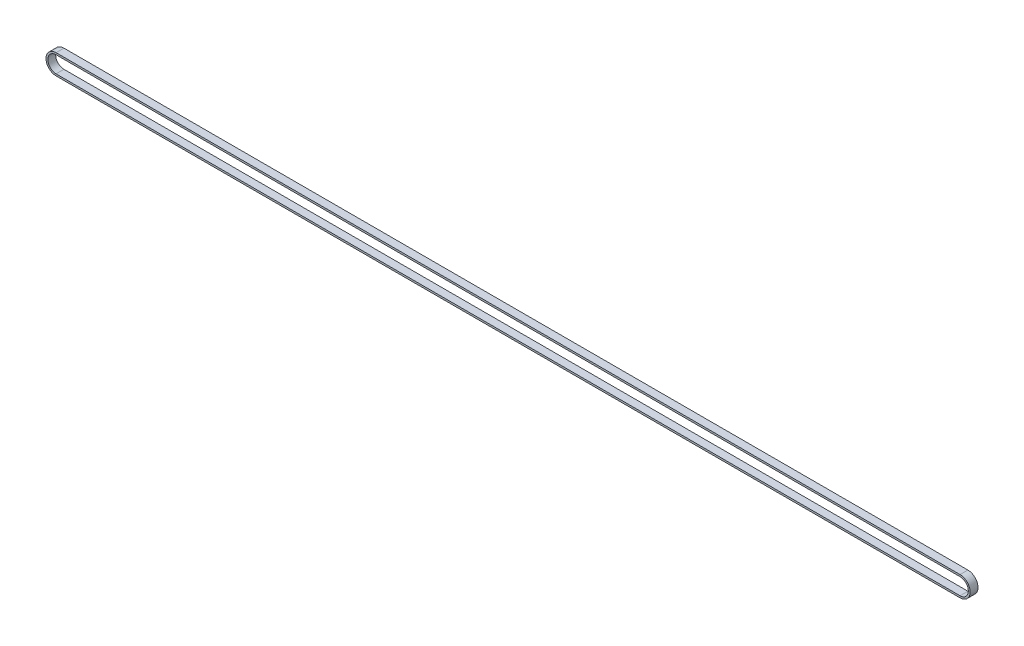
ISO-10303-21;
HEADER;
FILE_DESCRIPTION(('STEP AP214'),'2;1');
FILE_NAME('part.step','',(''),(''),'','','');
FILE_SCHEMA(('AUTOMOTIVE_DESIGN { 1 0 10303 214 1 1 1 1 }'));
ENDSEC;
DATA;
#1=APPLICATION_CONTEXT('core data for automotive mechanical design processes');
#2=APPLICATION_PROTOCOL_DEFINITION('international standard','automotive_design',2000,#1);
#3=PRODUCT_CONTEXT('',#1,'mechanical');
#4=PRODUCT('Part','Part','',(#3));
#5=PRODUCT_RELATED_PRODUCT_CATEGORY('part','',(#4));
#6=PRODUCT_DEFINITION_FORMATION('','',#4);
#7=PRODUCT_DEFINITION_CONTEXT('part definition',#1,'design');
#8=PRODUCT_DEFINITION('design','',#6,#7);
#9=PRODUCT_DEFINITION_SHAPE('','',#8);
#10=(LENGTH_UNIT() NAMED_UNIT(*) SI_UNIT(.MILLI.,.METRE.));
#11=(NAMED_UNIT(*) PLANE_ANGLE_UNIT() SI_UNIT($,.RADIAN.));
#12=(NAMED_UNIT(*) SI_UNIT($,.STERADIAN.) SOLID_ANGLE_UNIT());
#13=UNCERTAINTY_MEASURE_WITH_UNIT(LENGTH_MEASURE(1.E-05),#10,'distance_accuracy_value','');
#14=(GEOMETRIC_REPRESENTATION_CONTEXT(3) GLOBAL_UNCERTAINTY_ASSIGNED_CONTEXT((#13)) GLOBAL_UNIT_ASSIGNED_CONTEXT((#10,
#11,#12)) REPRESENTATION_CONTEXT('',''));
#15=CARTESIAN_POINT('',(0.,0.,0.));
#16=DIRECTION('',(0.,0.,1.));
#17=DIRECTION('',(1.,0.,0.));
#18=AXIS2_PLACEMENT_3D('',#15,#16,#17);
#19=CARTESIAN_POINT('',(0.,-6.3,1.5));
#20=DIRECTION('',(0.,-1.,0.));
#21=DIRECTION('',(0.,0.,-1.));
#22=AXIS2_PLACEMENT_3D('',#19,#20,#21);
#23=PLANE('',#22);
#24=DIRECTION('',(1.,0.,0.));
#25=VECTOR('',#24,1.);
#26=CARTESIAN_POINT('',(0.,-6.3,7.5));
#27=LINE('',#26,#25);
#28=CARTESIAN_POINT('',(0.,-6.3,7.5));
#29=VERTEX_POINT('',#28);
#30=CARTESIAN_POINT('',(690.,-6.3,7.5));
#31=VERTEX_POINT('',#30);
#32=EDGE_CURVE('E152',#29,#31,#27,.T.);
#33=ORIENTED_EDGE('',*,*,#32,.T.);
#34=DIRECTION('',(0.,0.,1.));
#35=VECTOR('',#34,1.);
#36=CARTESIAN_POINT('',(690.,-6.3,1.5));
#37=LINE('',#36,#35);
#38=CARTESIAN_POINT('',(690.,-6.3,1.5));
#39=VERTEX_POINT('',#38);
#40=EDGE_CURVE('E10',#39,#31,#37,.T.);
#41=ORIENTED_EDGE('',*,*,#40,.F.);
#42=DIRECTION('',(1.,0.,0.));
#43=VECTOR('',#42,1.);
#44=CARTESIAN_POINT('',(0.,-6.3,1.5));
#45=LINE('',#44,#43);
#46=CARTESIAN_POINT('',(0.,-6.3,1.5));
#47=VERTEX_POINT('',#46);
#48=EDGE_CURVE('E180',#47,#39,#45,.T.);
#49=ORIENTED_EDGE('',*,*,#48,.F.);
#50=DIRECTION('',(0.,0.,1.));
#51=VECTOR('',#50,1.);
#52=CARTESIAN_POINT('',(0.,-6.3,1.5));
#53=LINE('',#52,#51);
#54=EDGE_CURVE('E25',#47,#29,#53,.T.);
#55=ORIENTED_EDGE('',*,*,#54,.T.);
#56=EDGE_LOOP('',(#33,#41,#49,#55));
#57=FACE_BOUND('',#56,.T.);
#58=ADVANCED_FACE('F16',(#57),#23,.F.);
#59=CARTESIAN_POINT('',(690.,0.,1.));
#60=DIRECTION('',(0.,0.,1.));
#61=DIRECTION('',(0.,-1.,0.));
#62=AXIS2_PLACEMENT_3D('',#59,#60,#61);
#63=CYLINDRICAL_SURFACE('',#62,6.3);
#64=DIRECTION('',(0.,0.,1.));
#65=VECTOR('',#64,1.);
#66=CARTESIAN_POINT('',(690.,6.3,1.5));
#67=LINE('',#66,#65);
#68=CARTESIAN_POINT('',(690.,6.3,1.5));
#69=VERTEX_POINT('',#68);
#70=CARTESIAN_POINT('',(690.,6.3,7.5));
#71=VERTEX_POINT('',#70);
#72=EDGE_CURVE('E36',#69,#71,#67,.T.);
#73=ORIENTED_EDGE('',*,*,#72,.F.);
#74=CARTESIAN_POINT('',(690.,0.,1.5));
#75=DIRECTION('',(0.,0.,1.));
#76=DIRECTION('',(0.,-1.,0.));
#77=AXIS2_PLACEMENT_3D('',#74,#75,#76);
#78=CIRCLE('',#77,6.3);
#79=EDGE_CURVE('E170',#39,#69,#78,.T.);
#80=ORIENTED_EDGE('',*,*,#79,.F.);
#81=ORIENTED_EDGE('',*,*,#40,.T.);
#82=CARTESIAN_POINT('',(690.,0.,7.5));
#83=DIRECTION('',(0.,0.,1.));
#84=DIRECTION('',(0.,-1.,0.));
#85=AXIS2_PLACEMENT_3D('',#82,#83,#84);
#86=CIRCLE('',#85,6.3);
#87=EDGE_CURVE('E144',#31,#71,#86,.T.);
#88=ORIENTED_EDGE('',*,*,#87,.T.);
#89=EDGE_LOOP('',(#73,#80,#81,#88));
#90=FACE_BOUND('',#89,.T.);
#91=ADVANCED_FACE('F199',(#90),#63,.F.);
#92=CARTESIAN_POINT('',(0.,0.,1.));
#93=DIRECTION('',(0.,0.,1.));
#94=DIRECTION('',(0.,-1.,0.));
#95=AXIS2_PLACEMENT_3D('',#92,#93,#94);
#96=CYLINDRICAL_SURFACE('',#95,6.3);
#97=CARTESIAN_POINT('',(0.,0.,1.5));
#98=DIRECTION('',(0.,0.,1.));
#99=DIRECTION('',(0.,-1.,0.));
#100=AXIS2_PLACEMENT_3D('',#97,#98,#99);
#101=CIRCLE('',#100,6.3);
#102=CARTESIAN_POINT('',(0.,6.3,1.5));
#103=VERTEX_POINT('',#102);
#104=EDGE_CURVE('E176',#103,#47,#101,.T.);
#105=ORIENTED_EDGE('',*,*,#104,.F.);
#106=DIRECTION('',(0.,0.,1.));
#107=VECTOR('',#106,1.);
#108=CARTESIAN_POINT('',(0.,6.3,1.5));
#109=LINE('',#108,#107);
#110=CARTESIAN_POINT('',(0.,6.3,7.5));
#111=VERTEX_POINT('',#110);
#112=EDGE_CURVE('E159',#103,#111,#109,.T.);
#113=ORIENTED_EDGE('',*,*,#112,.T.);
#114=CARTESIAN_POINT('',(0.,0.,7.5));
#115=DIRECTION('',(0.,0.,1.));
#116=DIRECTION('',(0.,-1.,0.));
#117=AXIS2_PLACEMENT_3D('',#114,#115,#116);
#118=CIRCLE('',#117,6.3);
#119=EDGE_CURVE('E156',#111,#29,#118,.T.);
#120=ORIENTED_EDGE('',*,*,#119,.T.);
#121=ORIENTED_EDGE('',*,*,#54,.F.);
#122=EDGE_LOOP('',(#105,#113,#120,#121));
#123=FACE_BOUND('',#122,.T.);
#124=ADVANCED_FACE('F191',(#123),#96,.F.);
#125=CARTESIAN_POINT('',(0.,6.3,1.5));
#126=DIRECTION('',(0.,-1.,0.));
#127=DIRECTION('',(0.,0.,-1.));
#128=AXIS2_PLACEMENT_3D('',#125,#126,#127);
#129=PLANE('',#128);
#130=ORIENTED_EDGE('',*,*,#112,.F.);
#131=DIRECTION('',(1.,0.,0.));
#132=VECTOR('',#131,1.);
#133=CARTESIAN_POINT('',(0.,6.3,1.5));
#134=LINE('',#133,#132);
#135=EDGE_CURVE('E167',#103,#69,#134,.T.);
#136=ORIENTED_EDGE('',*,*,#135,.T.);
#137=ORIENTED_EDGE('',*,*,#72,.T.);
#138=DIRECTION('',(1.,0.,0.));
#139=VECTOR('',#138,1.);
#140=CARTESIAN_POINT('',(0.,6.3,7.5));
#141=LINE('',#140,#139);
#142=EDGE_CURVE('E141',#111,#71,#141,.T.);
#143=ORIENTED_EDGE('',*,*,#142,.F.);
#144=EDGE_LOOP('',(#130,#136,#137,#143));
#145=FACE_BOUND('',#144,.T.);
#146=ADVANCED_FACE('F198',(#145),#129,.T.);
#147=CARTESIAN_POINT('',(0.,-7.7,1.5));
#148=DIRECTION('',(0.,-1.,0.));
#149=DIRECTION('',(0.,0.,-1.));
#150=AXIS2_PLACEMENT_3D('',#147,#148,#149);
#151=PLANE('',#150);
#152=DIRECTION('',(0.,0.,1.));
#153=VECTOR('',#152,1.);
#154=CARTESIAN_POINT('',(0.,-7.7,1.5));
#155=LINE('',#154,#153);
#156=CARTESIAN_POINT('',(0.,-7.7,1.5));
#157=VERTEX_POINT('',#156);
#158=CARTESIAN_POINT('',(0.,-7.7,7.5));
#159=VERTEX_POINT('',#158);
#160=EDGE_CURVE('E105',#157,#159,#155,.T.);
#161=ORIENTED_EDGE('',*,*,#160,.F.);
#162=DIRECTION('',(1.,0.,0.));
#163=VECTOR('',#162,1.);
#164=CARTESIAN_POINT('',(0.,-7.7,1.5));
#165=LINE('',#164,#163);
#166=CARTESIAN_POINT('',(690.,-7.7,1.5));
#167=VERTEX_POINT('',#166);
#168=EDGE_CURVE('E173',#157,#167,#165,.T.);
#169=ORIENTED_EDGE('',*,*,#168,.T.);
#170=DIRECTION('',(0.,0.,1.));
#171=VECTOR('',#170,1.);
#172=CARTESIAN_POINT('',(690.,-7.7,1.5));
#173=LINE('',#172,#171);
#174=CARTESIAN_POINT('',(690.,-7.7,7.5));
#175=VERTEX_POINT('',#174);
#176=EDGE_CURVE('E163',#167,#175,#173,.T.);
#177=ORIENTED_EDGE('',*,*,#176,.T.);
#178=DIRECTION('',(1.,0.,0.));
#179=VECTOR('',#178,1.);
#180=CARTESIAN_POINT('',(0.,-7.7,7.5));
#181=LINE('',#180,#179);
#182=EDGE_CURVE('E134',#159,#175,#181,.T.);
#183=ORIENTED_EDGE('',*,*,#182,.F.);
#184=EDGE_LOOP('',(#161,#169,#177,#183));
#185=FACE_BOUND('',#184,.T.);
#186=ADVANCED_FACE('F207',(#185),#151,.T.);
#187=CARTESIAN_POINT('',(0.,7.7,1.5));
#188=DIRECTION('',(0.,0.,1.));
#189=DIRECTION('',(1.,0.,0.));
#190=AXIS2_PLACEMENT_3D('',#187,#188,#189);
#191=PLANE('',#190);
#192=ORIENTED_EDGE('',*,*,#104,.T.);
#193=ORIENTED_EDGE('',*,*,#48,.T.);
#194=ORIENTED_EDGE('',*,*,#79,.T.);
#195=ORIENTED_EDGE('',*,*,#135,.F.);
#196=EDGE_LOOP('',(#192,#193,#194,#195));
#197=FACE_BOUND('',#196,.T.);
#198=CARTESIAN_POINT('',(690.,0.,1.5));
#199=DIRECTION('',(0.,0.,1.));
#200=DIRECTION('',(0.,-1.,0.));
#201=AXIS2_PLACEMENT_3D('',#198,#199,#200);
#202=CIRCLE('',#201,7.7);
#203=CARTESIAN_POINT('',(690.,7.7,1.5));
#204=VERTEX_POINT('',#203);
#205=EDGE_CURVE('E166',#167,#204,#202,.T.);
#206=ORIENTED_EDGE('',*,*,#205,.F.);
#207=ORIENTED_EDGE('',*,*,#168,.F.);
#208=CARTESIAN_POINT('',(0.,0.,1.5));
#209=DIRECTION('',(0.,0.,1.));
#210=DIRECTION('',(0.,-1.,0.));
#211=AXIS2_PLACEMENT_3D('',#208,#209,#210);
#212=CIRCLE('',#211,7.7);
#213=CARTESIAN_POINT('',(0.,7.7,1.5));
#214=VERTEX_POINT('',#213);
#215=EDGE_CURVE('E110',#214,#157,#212,.T.);
#216=ORIENTED_EDGE('',*,*,#215,.F.);
#217=DIRECTION('',(1.,0.,0.));
#218=VECTOR('',#217,1.);
#219=CARTESIAN_POINT('',(0.,7.7,1.5));
#220=LINE('',#219,#218);
#221=EDGE_CURVE('E118',#214,#204,#220,.T.);
#222=ORIENTED_EDGE('',*,*,#221,.T.);
#223=EDGE_LOOP('',(#206,#207,#216,#222));
#224=FACE_BOUND('',#223,.T.);
#225=ADVANCED_FACE('F203',(#197,#224),#191,.F.);
#226=CARTESIAN_POINT('',(690.,0.,1.5));
#227=DIRECTION('',(0.,0.,1.));
#228=DIRECTION('',(0.,-1.,0.));
#229=AXIS2_PLACEMENT_3D('',#226,#227,#228);
#230=CYLINDRICAL_SURFACE('',#229,7.7);
#231=CARTESIAN_POINT('',(690.,0.,7.5));
#232=DIRECTION('',(0.,0.,1.));
#233=DIRECTION('',(0.,-1.,0.));
#234=AXIS2_PLACEMENT_3D('',#231,#232,#233);
#235=CIRCLE('',#234,7.7);
#236=CARTESIAN_POINT('',(690.,7.7,7.5));
#237=VERTEX_POINT('',#236);
#238=EDGE_CURVE('E123',#175,#237,#235,.T.);
#239=ORIENTED_EDGE('',*,*,#238,.F.);
#240=ORIENTED_EDGE('',*,*,#176,.F.);
#241=ORIENTED_EDGE('',*,*,#205,.T.);
#242=DIRECTION('',(0.,0.,1.));
#243=VECTOR('',#242,1.);
#244=CARTESIAN_POINT('',(690.,7.7,1.5));
#245=LINE('',#244,#243);
#246=EDGE_CURVE('E126',#204,#237,#245,.T.);
#247=ORIENTED_EDGE('',*,*,#246,.T.);
#248=EDGE_LOOP('',(#239,#240,#241,#247));
#249=FACE_BOUND('',#248,.T.);
#250=ADVANCED_FACE('F206',(#249),#230,.T.);
#251=CARTESIAN_POINT('',(0.,7.7,7.5));
#252=DIRECTION('',(0.,0.,1.));
#253=DIRECTION('',(1.,0.,0.));
#254=AXIS2_PLACEMENT_3D('',#251,#252,#253);
#255=PLANE('',#254);
#256=ORIENTED_EDGE('',*,*,#142,.T.);
#257=ORIENTED_EDGE('',*,*,#87,.F.);
#258=ORIENTED_EDGE('',*,*,#32,.F.);
#259=ORIENTED_EDGE('',*,*,#119,.F.);
#260=EDGE_LOOP('',(#256,#257,#258,#259));
#261=FACE_BOUND('',#260,.T.);
#262=DIRECTION('',(1.,0.,0.));
#263=VECTOR('',#262,1.);
#264=CARTESIAN_POINT('',(0.,7.7,7.5));
#265=LINE('',#264,#263);
#266=CARTESIAN_POINT('',(0.,7.7,7.5));
#267=VERTEX_POINT('',#266);
#268=EDGE_CURVE('E116',#267,#237,#265,.T.);
#269=ORIENTED_EDGE('',*,*,#268,.F.);
#270=CARTESIAN_POINT('',(0.,0.,7.5));
#271=DIRECTION('',(0.,0.,1.));
#272=DIRECTION('',(0.,-1.,0.));
#273=AXIS2_PLACEMENT_3D('',#270,#271,#272);
#274=CIRCLE('',#273,7.7);
#275=EDGE_CURVE('E98',#267,#159,#274,.T.);
#276=ORIENTED_EDGE('',*,*,#275,.T.);
#277=ORIENTED_EDGE('',*,*,#182,.T.);
#278=ORIENTED_EDGE('',*,*,#238,.T.);
#279=EDGE_LOOP('',(#269,#276,#277,#278));
#280=FACE_BOUND('',#279,.T.);
#281=ADVANCED_FACE('F121',(#261,#280),#255,.T.);
#282=CARTESIAN_POINT('',(0.,0.,1.5));
#283=DIRECTION('',(0.,0.,1.));
#284=DIRECTION('',(0.,-1.,0.));
#285=AXIS2_PLACEMENT_3D('',#282,#283,#284);
#286=CYLINDRICAL_SURFACE('',#285,7.7);
#287=ORIENTED_EDGE('',*,*,#160,.T.);
#288=ORIENTED_EDGE('',*,*,#275,.F.);
#289=DIRECTION('',(0.,0.,1.));
#290=VECTOR('',#289,1.);
#291=CARTESIAN_POINT('',(0.,7.7,1.5));
#292=LINE('',#291,#290);
#293=EDGE_CURVE('E102',#214,#267,#292,.T.);
#294=ORIENTED_EDGE('',*,*,#293,.F.);
#295=ORIENTED_EDGE('',*,*,#215,.T.);
#296=EDGE_LOOP('',(#287,#288,#294,#295));
#297=FACE_BOUND('',#296,.T.);
#298=ADVANCED_FACE('F100',(#297),#286,.T.);
#299=CARTESIAN_POINT('',(0.,7.7,1.5));
#300=DIRECTION('',(0.,-1.,0.));
#301=DIRECTION('',(0.,0.,-1.));
#302=AXIS2_PLACEMENT_3D('',#299,#300,#301);
#303=PLANE('',#302);
#304=ORIENTED_EDGE('',*,*,#268,.T.);
#305=ORIENTED_EDGE('',*,*,#246,.F.);
#306=ORIENTED_EDGE('',*,*,#221,.F.);
#307=ORIENTED_EDGE('',*,*,#293,.T.);
#308=EDGE_LOOP('',(#304,#305,#306,#307));
#309=FACE_BOUND('',#308,.T.);
#310=ADVANCED_FACE('F114',(#309),#303,.F.);
#311=CLOSED_SHELL('',(#58,#91,#124,#146,#186,#225,#250,#281,#298,#310));
#312=MANIFOLD_SOLID_BREP('B1',#311);
#313=ADVANCED_BREP_SHAPE_REPRESENTATION('',(#18,#312),#14);
#314=SHAPE_DEFINITION_REPRESENTATION(#9,#313);
ENDSEC;
END-ISO-10303-21;
